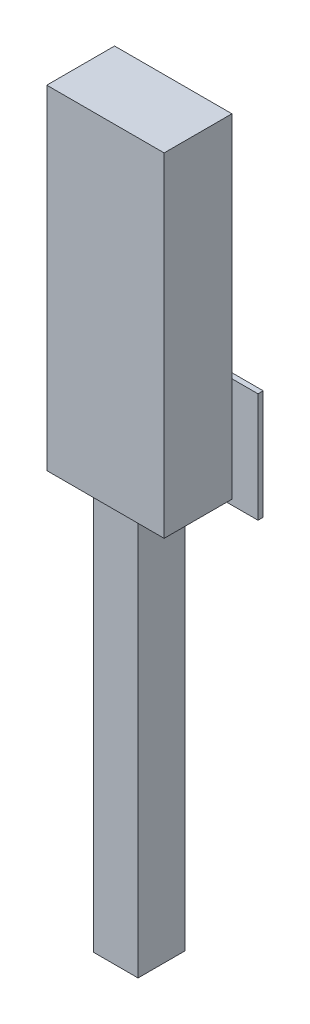
ISO-10303-21;
HEADER;
FILE_DESCRIPTION(('STEP AP214'),'2;1');
FILE_NAME('part.step','',(''),(''),'','','');
FILE_SCHEMA(('AUTOMOTIVE_DESIGN { 1 0 10303 214 1 1 1 1 }'));
ENDSEC;
DATA;
#1=APPLICATION_CONTEXT('core data for automotive mechanical design processes');
#2=APPLICATION_PROTOCOL_DEFINITION('international standard','automotive_design',2000,#1);
#3=PRODUCT_CONTEXT('',#1,'mechanical');
#4=PRODUCT('Part','Part','',(#3));
#5=PRODUCT_RELATED_PRODUCT_CATEGORY('part','',(#4));
#6=PRODUCT_DEFINITION_FORMATION('','',#4);
#7=PRODUCT_DEFINITION_CONTEXT('part definition',#1,'design');
#8=PRODUCT_DEFINITION('design','',#6,#7);
#9=PRODUCT_DEFINITION_SHAPE('','',#8);
#10=(LENGTH_UNIT() NAMED_UNIT(*) SI_UNIT(.MILLI.,.METRE.));
#11=(NAMED_UNIT(*) PLANE_ANGLE_UNIT() SI_UNIT($,.RADIAN.));
#12=(NAMED_UNIT(*) SI_UNIT($,.STERADIAN.) SOLID_ANGLE_UNIT());
#13=UNCERTAINTY_MEASURE_WITH_UNIT(LENGTH_MEASURE(1.E-05),#10,'distance_accuracy_value','');
#14=(GEOMETRIC_REPRESENTATION_CONTEXT(3) GLOBAL_UNCERTAINTY_ASSIGNED_CONTEXT((#13)) GLOBAL_UNIT_ASSIGNED_CONTEXT((#10,
#11,#12)) REPRESENTATION_CONTEXT('',''));
#15=CARTESIAN_POINT('',(0.,0.,0.));
#16=DIRECTION('',(0.,0.,1.));
#17=DIRECTION('',(1.,0.,0.));
#18=AXIS2_PLACEMENT_3D('',#15,#16,#17);
#19=CARTESIAN_POINT('',(96.,150.,48.));
#20=DIRECTION('',(0.,0.,-1.));
#21=DIRECTION('',(-1.,0.,0.));
#22=AXIS2_PLACEMENT_3D('',#19,#20,#21);
#23=PLANE('',#22);
#24=DIRECTION('',(0.,-1.,0.));
#25=VECTOR('',#24,1.);
#26=CARTESIAN_POINT('',(30.,150.,48.));
#27=LINE('',#26,#25);
#28=CARTESIAN_POINT('',(30.,192.,48.));
#29=VERTEX_POINT('',#28);
#30=CARTESIAN_POINT('',(30.,150.,48.));
#31=VERTEX_POINT('',#30);
#32=EDGE_CURVE('E115',#29,#31,#27,.T.);
#33=ORIENTED_EDGE('',*,*,#32,.T.);
#34=DIRECTION('',(-1.,0.,0.));
#35=VECTOR('',#34,1.);
#36=CARTESIAN_POINT('',(96.,150.,48.));
#37=LINE('',#36,#35);
#38=CARTESIAN_POINT('',(96.,150.,48.));
#39=VERTEX_POINT('',#38);
#40=EDGE_CURVE('E12',#39,#31,#37,.T.);
#41=ORIENTED_EDGE('',*,*,#40,.F.);
#42=DIRECTION('',(0.,-1.,0.));
#43=VECTOR('',#42,1.);
#44=CARTESIAN_POINT('',(96.,150.,48.));
#45=LINE('',#44,#43);
#46=CARTESIAN_POINT('',(96.,192.,48.));
#47=VERTEX_POINT('',#46);
#48=EDGE_CURVE('E103',#47,#39,#45,.T.);
#49=ORIENTED_EDGE('',*,*,#48,.F.);
#50=DIRECTION('',(-1.,0.,0.));
#51=VECTOR('',#50,1.);
#52=CARTESIAN_POINT('',(96.,192.,48.));
#53=LINE('',#52,#51);
#54=EDGE_CURVE('E111',#47,#29,#53,.T.);
#55=ORIENTED_EDGE('',*,*,#54,.T.);
#56=EDGE_LOOP('',(#33,#41,#49,#55));
#57=FACE_BOUND('',#56,.T.);
#58=ADVANCED_FACE('F52',(#57),#23,.F.);
#59=CARTESIAN_POINT('',(96.,150.,46.));
#60=DIRECTION('',(0.,1.,0.));
#61=DIRECTION('',(0.,0.,1.));
#62=AXIS2_PLACEMENT_3D('',#59,#60,#61);
#63=PLANE('',#62);
#64=DIRECTION('',(0.,0.,-1.));
#65=VECTOR('',#64,1.);
#66=CARTESIAN_POINT('',(30.,150.,46.));
#67=LINE('',#66,#65);
#68=CARTESIAN_POINT('',(30.,150.,46.));
#69=VERTEX_POINT('',#68);
#70=EDGE_CURVE('E107',#31,#69,#67,.T.);
#71=ORIENTED_EDGE('',*,*,#70,.T.);
#72=DIRECTION('',(-1.,0.,0.));
#73=VECTOR('',#72,1.);
#74=CARTESIAN_POINT('',(96.,150.,46.));
#75=LINE('',#74,#73);
#76=CARTESIAN_POINT('',(96.,150.,46.));
#77=VERTEX_POINT('',#76);
#78=EDGE_CURVE('E60',#77,#69,#75,.T.);
#79=ORIENTED_EDGE('',*,*,#78,.F.);
#80=DIRECTION('',(0.,0.,-1.));
#81=VECTOR('',#80,1.);
#82=CARTESIAN_POINT('',(96.,150.,46.));
#83=LINE('',#82,#81);
#84=EDGE_CURVE('E98',#39,#77,#83,.T.);
#85=ORIENTED_EDGE('',*,*,#84,.F.);
#86=ORIENTED_EDGE('',*,*,#40,.T.);
#87=EDGE_LOOP('',(#71,#79,#85,#86));
#88=FACE_BOUND('',#87,.T.);
#89=ADVANCED_FACE('F106',(#88),#63,.F.);
#90=CARTESIAN_POINT('',(96.,150.,46.));
#91=DIRECTION('',(0.,0.,1.));
#92=DIRECTION('',(1.,0.,0.));
#93=AXIS2_PLACEMENT_3D('',#90,#91,#92);
#94=PLANE('',#93);
#95=DIRECTION('',(0.,1.,0.));
#96=VECTOR('',#95,1.);
#97=CARTESIAN_POINT('',(30.,150.,46.));
#98=LINE('',#97,#96);
#99=CARTESIAN_POINT('',(30.,192.,46.));
#100=VERTEX_POINT('',#99);
#101=EDGE_CURVE('E85',#69,#100,#98,.T.);
#102=ORIENTED_EDGE('',*,*,#101,.T.);
#103=DIRECTION('',(-1.,0.,0.));
#104=VECTOR('',#103,1.);
#105=CARTESIAN_POINT('',(96.,192.,46.));
#106=LINE('',#105,#104);
#107=CARTESIAN_POINT('',(96.,192.,46.));
#108=VERTEX_POINT('',#107);
#109=EDGE_CURVE('E108',#108,#100,#106,.T.);
#110=ORIENTED_EDGE('',*,*,#109,.F.);
#111=DIRECTION('',(0.,1.,0.));
#112=VECTOR('',#111,1.);
#113=CARTESIAN_POINT('',(96.,150.,46.));
#114=LINE('',#113,#112);
#115=EDGE_CURVE('E101',#77,#108,#114,.T.);
#116=ORIENTED_EDGE('',*,*,#115,.F.);
#117=ORIENTED_EDGE('',*,*,#78,.T.);
#118=EDGE_LOOP('',(#102,#110,#116,#117));
#119=FACE_BOUND('',#118,.T.);
#120=ADVANCED_FACE('F109',(#119),#94,.F.);
#121=CARTESIAN_POINT('',(96.,192.,46.));
#122=DIRECTION('',(0.,-1.,0.));
#123=DIRECTION('',(0.,0.,-1.));
#124=AXIS2_PLACEMENT_3D('',#121,#122,#123);
#125=PLANE('',#124);
#126=DIRECTION('',(0.,0.,1.));
#127=VECTOR('',#126,1.);
#128=CARTESIAN_POINT('',(30.,192.,46.));
#129=LINE('',#128,#127);
#130=EDGE_CURVE('E91',#100,#29,#129,.T.);
#131=ORIENTED_EDGE('',*,*,#130,.T.);
#132=ORIENTED_EDGE('',*,*,#54,.F.);
#133=DIRECTION('',(0.,0.,1.));
#134=VECTOR('',#133,1.);
#135=CARTESIAN_POINT('',(96.,192.,46.));
#136=LINE('',#135,#134);
#137=EDGE_CURVE('E68',#108,#47,#136,.T.);
#138=ORIENTED_EDGE('',*,*,#137,.F.);
#139=ORIENTED_EDGE('',*,*,#109,.T.);
#140=EDGE_LOOP('',(#131,#132,#138,#139));
#141=FACE_BOUND('',#140,.T.);
#142=ADVANCED_FACE('F122',(#141),#125,.F.);
#143=CARTESIAN_POINT('',(96.,0.,0.));
#144=DIRECTION('',(1.,0.,0.));
#145=DIRECTION('',(0.,0.,-1.));
#146=AXIS2_PLACEMENT_3D('',#143,#144,#145);
#147=PLANE('',#146);
#148=ORIENTED_EDGE('',*,*,#48,.T.);
#149=ORIENTED_EDGE('',*,*,#84,.T.);
#150=ORIENTED_EDGE('',*,*,#115,.T.);
#151=ORIENTED_EDGE('',*,*,#137,.T.);
#152=EDGE_LOOP('',(#148,#149,#150,#151));
#153=FACE_BOUND('',#152,.T.);
#154=ADVANCED_FACE('F99',(#153),#147,.T.);
#155=CARTESIAN_POINT('',(30.,0.,0.));
#156=DIRECTION('',(1.,0.,0.));
#157=DIRECTION('',(0.,0.,-1.));
#158=AXIS2_PLACEMENT_3D('',#155,#156,#157);
#159=PLANE('',#158);
#160=ORIENTED_EDGE('',*,*,#32,.F.);
#161=ORIENTED_EDGE('',*,*,#130,.F.);
#162=ORIENTED_EDGE('',*,*,#101,.F.);
#163=ORIENTED_EDGE('',*,*,#70,.F.);
#164=EDGE_LOOP('',(#160,#161,#162,#163));
#165=FACE_BOUND('',#164,.T.);
#166=ADVANCED_FACE('F125',(#165),#159,.F.);
#167=CLOSED_SHELL('',(#58,#89,#120,#142,#154,#166));
#168=MANIFOLD_SOLID_BREP('B2',#167);
#169=CARTESIAN_POINT('',(75.,0.,73.));
#170=DIRECTION('',(0.,0.,-1.));
#171=DIRECTION('',(-1.,0.,0.));
#172=AXIS2_PLACEMENT_3D('',#169,#170,#171);
#173=PLANE('',#172);
#174=DIRECTION('',(0.,-1.,0.));
#175=VECTOR('',#174,1.);
#176=CARTESIAN_POINT('',(58.,0.,73.));
#177=LINE('',#176,#175);
#178=CARTESIAN_POINT('',(58.,155.,73.));
#179=VERTEX_POINT('',#178);
#180=CARTESIAN_POINT('',(58.,0.,73.));
#181=VERTEX_POINT('',#180);
#182=EDGE_CURVE('E247',#179,#181,#177,.T.);
#183=ORIENTED_EDGE('',*,*,#182,.T.);
#184=DIRECTION('',(-1.,0.,0.));
#185=VECTOR('',#184,1.);
#186=CARTESIAN_POINT('',(75.,0.,73.));
#187=LINE('',#186,#185);
#188=CARTESIAN_POINT('',(75.,0.,73.));
#189=VERTEX_POINT('',#188);
#190=EDGE_CURVE('E50',#189,#181,#187,.T.);
#191=ORIENTED_EDGE('',*,*,#190,.F.);
#192=DIRECTION('',(0.,-1.,0.));
#193=VECTOR('',#192,1.);
#194=CARTESIAN_POINT('',(75.,0.,73.));
#195=LINE('',#194,#193);
#196=CARTESIAN_POINT('',(75.,155.,73.));
#197=VERTEX_POINT('',#196);
#198=EDGE_CURVE('E235',#197,#189,#195,.T.);
#199=ORIENTED_EDGE('',*,*,#198,.F.);
#200=DIRECTION('',(-1.,0.,0.));
#201=VECTOR('',#200,1.);
#202=CARTESIAN_POINT('',(75.,155.,73.));
#203=LINE('',#202,#201);
#204=EDGE_CURVE('E243',#197,#179,#203,.T.);
#205=ORIENTED_EDGE('',*,*,#204,.T.);
#206=EDGE_LOOP('',(#183,#191,#199,#205));
#207=FACE_BOUND('',#206,.T.);
#208=ADVANCED_FACE('F184',(#207),#173,.F.);
#209=CARTESIAN_POINT('',(75.,0.,55.));
#210=DIRECTION('',(0.,1.,0.));
#211=DIRECTION('',(0.,0.,1.));
#212=AXIS2_PLACEMENT_3D('',#209,#210,#211);
#213=PLANE('',#212);
#214=DIRECTION('',(0.,0.,-1.));
#215=VECTOR('',#214,1.);
#216=CARTESIAN_POINT('',(58.,0.,55.));
#217=LINE('',#216,#215);
#218=CARTESIAN_POINT('',(58.,0.,55.));
#219=VERTEX_POINT('',#218);
#220=EDGE_CURVE('E239',#181,#219,#217,.T.);
#221=ORIENTED_EDGE('',*,*,#220,.T.);
#222=DIRECTION('',(-1.,0.,0.));
#223=VECTOR('',#222,1.);
#224=CARTESIAN_POINT('',(75.,0.,55.));
#225=LINE('',#224,#223);
#226=CARTESIAN_POINT('',(75.,0.,55.));
#227=VERTEX_POINT('',#226);
#228=EDGE_CURVE('E192',#227,#219,#225,.T.);
#229=ORIENTED_EDGE('',*,*,#228,.F.);
#230=DIRECTION('',(0.,0.,-1.));
#231=VECTOR('',#230,1.);
#232=CARTESIAN_POINT('',(75.,0.,55.));
#233=LINE('',#232,#231);
#234=EDGE_CURVE('E230',#189,#227,#233,.T.);
#235=ORIENTED_EDGE('',*,*,#234,.F.);
#236=ORIENTED_EDGE('',*,*,#190,.T.);
#237=EDGE_LOOP('',(#221,#229,#235,#236));
#238=FACE_BOUND('',#237,.T.);
#239=ADVANCED_FACE('F238',(#238),#213,.F.);
#240=CARTESIAN_POINT('',(75.,0.,55.));
#241=DIRECTION('',(0.,0.,1.));
#242=DIRECTION('',(1.,0.,0.));
#243=AXIS2_PLACEMENT_3D('',#240,#241,#242);
#244=PLANE('',#243);
#245=DIRECTION('',(0.,1.,0.));
#246=VECTOR('',#245,1.);
#247=CARTESIAN_POINT('',(58.,0.,55.));
#248=LINE('',#247,#246);
#249=CARTESIAN_POINT('',(58.,155.,55.));
#250=VERTEX_POINT('',#249);
#251=EDGE_CURVE('E217',#219,#250,#248,.T.);
#252=ORIENTED_EDGE('',*,*,#251,.T.);
#253=DIRECTION('',(-1.,0.,0.));
#254=VECTOR('',#253,1.);
#255=CARTESIAN_POINT('',(75.,155.,55.));
#256=LINE('',#255,#254);
#257=CARTESIAN_POINT('',(75.,155.,55.));
#258=VERTEX_POINT('',#257);
#259=EDGE_CURVE('E240',#258,#250,#256,.T.);
#260=ORIENTED_EDGE('',*,*,#259,.F.);
#261=DIRECTION('',(0.,1.,0.));
#262=VECTOR('',#261,1.);
#263=CARTESIAN_POINT('',(75.,0.,55.));
#264=LINE('',#263,#262);
#265=EDGE_CURVE('E233',#227,#258,#264,.T.);
#266=ORIENTED_EDGE('',*,*,#265,.F.);
#267=ORIENTED_EDGE('',*,*,#228,.T.);
#268=EDGE_LOOP('',(#252,#260,#266,#267));
#269=FACE_BOUND('',#268,.T.);
#270=ADVANCED_FACE('F241',(#269),#244,.F.);
#271=CARTESIAN_POINT('',(75.,155.,55.));
#272=DIRECTION('',(0.,-1.,0.));
#273=DIRECTION('',(0.,0.,-1.));
#274=AXIS2_PLACEMENT_3D('',#271,#272,#273);
#275=PLANE('',#274);
#276=DIRECTION('',(0.,0.,1.));
#277=VECTOR('',#276,1.);
#278=CARTESIAN_POINT('',(58.,155.,55.));
#279=LINE('',#278,#277);
#280=EDGE_CURVE('E223',#250,#179,#279,.T.);
#281=ORIENTED_EDGE('',*,*,#280,.T.);
#282=ORIENTED_EDGE('',*,*,#204,.F.);
#283=DIRECTION('',(0.,0.,1.));
#284=VECTOR('',#283,1.);
#285=CARTESIAN_POINT('',(75.,155.,55.));
#286=LINE('',#285,#284);
#287=EDGE_CURVE('E200',#258,#197,#286,.T.);
#288=ORIENTED_EDGE('',*,*,#287,.F.);
#289=ORIENTED_EDGE('',*,*,#259,.T.);
#290=EDGE_LOOP('',(#281,#282,#288,#289));
#291=FACE_BOUND('',#290,.T.);
#292=ADVANCED_FACE('F254',(#291),#275,.F.);
#293=CARTESIAN_POINT('',(75.,0.,0.));
#294=DIRECTION('',(1.,0.,0.));
#295=DIRECTION('',(0.,0.,-1.));
#296=AXIS2_PLACEMENT_3D('',#293,#294,#295);
#297=PLANE('',#296);
#298=ORIENTED_EDGE('',*,*,#198,.T.);
#299=ORIENTED_EDGE('',*,*,#234,.T.);
#300=ORIENTED_EDGE('',*,*,#265,.T.);
#301=ORIENTED_EDGE('',*,*,#287,.T.);
#302=EDGE_LOOP('',(#298,#299,#300,#301));
#303=FACE_BOUND('',#302,.T.);
#304=ADVANCED_FACE('F231',(#303),#297,.T.);
#305=CARTESIAN_POINT('',(58.,0.,0.));
#306=DIRECTION('',(1.,0.,0.));
#307=DIRECTION('',(0.,0.,-1.));
#308=AXIS2_PLACEMENT_3D('',#305,#306,#307);
#309=PLANE('',#308);
#310=ORIENTED_EDGE('',*,*,#182,.F.);
#311=ORIENTED_EDGE('',*,*,#280,.F.);
#312=ORIENTED_EDGE('',*,*,#251,.F.);
#313=ORIENTED_EDGE('',*,*,#220,.F.);
#314=EDGE_LOOP('',(#310,#311,#312,#313));
#315=FACE_BOUND('',#314,.T.);
#316=ADVANCED_FACE('F257',(#315),#309,.F.);
#317=CLOSED_SHELL('',(#208,#239,#270,#292,#304,#316));
#318=MANIFOLD_SOLID_BREP('B6',#317);
#319=CARTESIAN_POINT('',(66.34,278.,59.5));
#320=DIRECTION('',(0.,-1.,0.));
#321=DIRECTION('',(0.,0.,-1.));
#322=AXIS2_PLACEMENT_3D('',#319,#320,#321);
#323=CYLINDRICAL_SURFACE('',#322,5.);
#324=CARTESIAN_POINT('',(66.34,278.,59.5));
#325=DIRECTION('',(0.,1.,0.));
#326=DIRECTION('',(0.,0.,1.));
#327=AXIS2_PLACEMENT_3D('',#324,#325,#326);
#328=CIRCLE('',#327,5.);
#329=CARTESIAN_POINT('',(66.34,278.,64.5));
#330=VERTEX_POINT('',#329);
#331=EDGE_CURVE('E183',#330,#330,#328,.T.);
#332=ORIENTED_EDGE('',*,*,#331,.F.);
#333=EDGE_LOOP('',(#332));
#334=FACE_BOUND('',#333,.T.);
#335=CARTESIAN_POINT('',(66.34,160.,59.5));
#336=DIRECTION('',(0.,1.,0.));
#337=DIRECTION('',(0.,0.,1.));
#338=AXIS2_PLACEMENT_3D('',#335,#336,#337);
#339=CIRCLE('',#338,5.);
#340=CARTESIAN_POINT('',(66.34,160.,64.5));
#341=VERTEX_POINT('',#340);
#342=EDGE_CURVE('E320',#341,#341,#339,.T.);
#343=ORIENTED_EDGE('',*,*,#342,.T.);
#344=EDGE_LOOP('',(#343));
#345=FACE_BOUND('',#344,.T.);
#346=ADVANCED_FACE('F317',(#334,#345),#323,.T.);
#347=CARTESIAN_POINT('',(66.34,278.,59.5));
#348=DIRECTION('',(0.,1.,0.));
#349=DIRECTION('',(0.,0.,1.));
#350=AXIS2_PLACEMENT_3D('',#347,#348,#349);
#351=PLANE('',#350);
#352=ORIENTED_EDGE('',*,*,#331,.T.);
#353=EDGE_LOOP('',(#352));
#354=FACE_BOUND('',#353,.T.);
#355=ADVANCED_FACE('F332',(#354),#351,.T.);
#356=CARTESIAN_POINT('',(66.34,160.,59.5));
#357=DIRECTION('',(0.,1.,0.));
#358=DIRECTION('',(0.,0.,1.));
#359=AXIS2_PLACEMENT_3D('',#356,#357,#358);
#360=PLANE('',#359);
#361=ORIENTED_EDGE('',*,*,#342,.F.);
#362=EDGE_LOOP('',(#361));
#363=FACE_BOUND('',#362,.T.);
#364=ADVANCED_FACE('F330',(#363),#360,.F.);
#365=CLOSED_SHELL('',(#346,#355,#364));
#366=MANIFOLD_SOLID_BREP('B44',#365);
#367=CARTESIAN_POINT('',(89.,155.,77.));
#368=DIRECTION('',(0.,0.,-1.));
#369=DIRECTION('',(-1.,0.,0.));
#370=AXIS2_PLACEMENT_3D('',#367,#368,#369);
#371=PLANE('',#370);
#372=DIRECTION('',(0.,-1.,0.));
#373=VECTOR('',#372,1.);
#374=CARTESIAN_POINT('',(44.,155.,77.));
#375=LINE('',#374,#373);
#376=CARTESIAN_POINT('',(44.,283.,77.));
#377=VERTEX_POINT('',#376);
#378=CARTESIAN_POINT('',(44.,155.,77.));
#379=VERTEX_POINT('',#378);
#380=EDGE_CURVE('E453',#377,#379,#375,.T.);
#381=ORIENTED_EDGE('',*,*,#380,.T.);
#382=DIRECTION('',(-1.,0.,0.));
#383=VECTOR('',#382,1.);
#384=CARTESIAN_POINT('',(89.,155.,77.));
#385=LINE('',#384,#383);
#386=CARTESIAN_POINT('',(89.,155.,77.));
#387=VERTEX_POINT('',#386);
#388=EDGE_CURVE('E478',#387,#379,#385,.T.);
#389=ORIENTED_EDGE('',*,*,#388,.F.);
#390=DIRECTION('',(0.,-1.,0.));
#391=VECTOR('',#390,1.);
#392=CARTESIAN_POINT('',(89.,155.,77.));
#393=LINE('',#392,#391);
#394=CARTESIAN_POINT('',(89.,283.,77.));
#395=VERTEX_POINT('',#394);
#396=EDGE_CURVE('E461',#395,#387,#393,.T.);
#397=ORIENTED_EDGE('',*,*,#396,.F.);
#398=DIRECTION('',(-1.,0.,0.));
#399=VECTOR('',#398,1.);
#400=CARTESIAN_POINT('',(89.,283.,77.));
#401=LINE('',#400,#399);
#402=EDGE_CURVE('E466',#395,#377,#401,.T.);
#403=ORIENTED_EDGE('',*,*,#402,.T.);
#404=EDGE_LOOP('',(#381,#389,#397,#403));
#405=FACE_BOUND('',#404,.T.);
#406=ADVANCED_FACE('F358',(#405),#371,.F.);
#407=CARTESIAN_POINT('',(89.,155.,51.));
#408=DIRECTION('',(0.,1.,0.));
#409=DIRECTION('',(0.,0.,1.));
#410=AXIS2_PLACEMENT_3D('',#407,#408,#409);
#411=PLANE('',#410);
#412=DIRECTION('',(0.,0.,-1.));
#413=VECTOR('',#412,1.);
#414=CARTESIAN_POINT('',(44.,155.,51.));
#415=LINE('',#414,#413);
#416=CARTESIAN_POINT('',(44.,155.,51.));
#417=VERTEX_POINT('',#416);
#418=EDGE_CURVE('E456',#379,#417,#415,.T.);
#419=ORIENTED_EDGE('',*,*,#418,.T.);
#420=DIRECTION('',(-1.,0.,0.));
#421=VECTOR('',#420,1.);
#422=CARTESIAN_POINT('',(89.,155.,51.));
#423=LINE('',#422,#421);
#424=CARTESIAN_POINT('',(89.,155.,51.));
#425=VERTEX_POINT('',#424);
#426=EDGE_CURVE('E475',#425,#417,#423,.T.);
#427=ORIENTED_EDGE('',*,*,#426,.F.);
#428=DIRECTION('',(0.,0.,-1.));
#429=VECTOR('',#428,1.);
#430=CARTESIAN_POINT('',(89.,155.,51.));
#431=LINE('',#430,#429);
#432=EDGE_CURVE('E410',#387,#425,#431,.T.);
#433=ORIENTED_EDGE('',*,*,#432,.F.);
#434=ORIENTED_EDGE('',*,*,#388,.T.);
#435=EDGE_LOOP('',(#419,#427,#433,#434));
#436=FACE_BOUND('',#435,.T.);
#437=ADVANCED_FACE('F506',(#436),#411,.F.);
#438=CARTESIAN_POINT('',(89.,155.,51.));
#439=DIRECTION('',(0.,0.,1.));
#440=DIRECTION('',(1.,0.,0.));
#441=AXIS2_PLACEMENT_3D('',#438,#439,#440);
#442=PLANE('',#441);
#443=DIRECTION('',(-1.,0.,0.));
#444=VECTOR('',#443,1.);
#445=CARTESIAN_POINT('',(89.,158.,51.));
#446=LINE('',#445,#444);
#447=CARTESIAN_POINT('',(86.,158.,51.));
#448=VERTEX_POINT('',#447);
#449=CARTESIAN_POINT('',(47.,158.,51.));
#450=VERTEX_POINT('',#449);
#451=EDGE_CURVE('E365',#448,#450,#446,.T.);
#452=ORIENTED_EDGE('',*,*,#451,.F.);
#453=DIRECTION('',(0.,1.,0.));
#454=VECTOR('',#453,1.);
#455=CARTESIAN_POINT('',(86.,155.,51.));
#456=LINE('',#455,#454);
#457=CARTESIAN_POINT('',(86.,280.,51.));
#458=VERTEX_POINT('',#457);
#459=EDGE_CURVE('E315',#448,#458,#456,.T.);
#460=ORIENTED_EDGE('',*,*,#459,.T.);
#461=DIRECTION('',(1.,0.,0.));
#462=VECTOR('',#461,1.);
#463=CARTESIAN_POINT('',(89.,280.,51.));
#464=LINE('',#463,#462);
#465=CARTESIAN_POINT('',(47.,280.,51.));
#466=VERTEX_POINT('',#465);
#467=EDGE_CURVE('E482',#466,#458,#464,.T.);
#468=ORIENTED_EDGE('',*,*,#467,.F.);
#469=DIRECTION('',(0.,1.,0.));
#470=VECTOR('',#469,1.);
#471=CARTESIAN_POINT('',(47.,155.,51.));
#472=LINE('',#471,#470);
#473=EDGE_CURVE('E480',#450,#466,#472,.T.);
#474=ORIENTED_EDGE('',*,*,#473,.F.);
#475=EDGE_LOOP('',(#452,#460,#468,#474));
#476=FACE_BOUND('',#475,.T.);
#477=DIRECTION('',(0.,1.,0.));
#478=VECTOR('',#477,1.);
#479=CARTESIAN_POINT('',(44.,155.,51.));
#480=LINE('',#479,#478);
#481=CARTESIAN_POINT('',(44.,283.,51.));
#482=VERTEX_POINT('',#481);
#483=EDGE_CURVE('E469',#417,#482,#480,.T.);
#484=ORIENTED_EDGE('',*,*,#483,.T.);
#485=DIRECTION('',(-1.,0.,0.));
#486=VECTOR('',#485,1.);
#487=CARTESIAN_POINT('',(89.,283.,51.));
#488=LINE('',#487,#486);
#489=CARTESIAN_POINT('',(89.,283.,51.));
#490=VERTEX_POINT('',#489);
#491=EDGE_CURVE('E473',#490,#482,#488,.T.);
#492=ORIENTED_EDGE('',*,*,#491,.F.);
#493=DIRECTION('',(0.,1.,0.));
#494=VECTOR('',#493,1.);
#495=CARTESIAN_POINT('',(89.,155.,51.));
#496=LINE('',#495,#494);
#497=EDGE_CURVE('E464',#425,#490,#496,.T.);
#498=ORIENTED_EDGE('',*,*,#497,.F.);
#499=ORIENTED_EDGE('',*,*,#426,.T.);
#500=EDGE_LOOP('',(#484,#492,#498,#499));
#501=FACE_BOUND('',#500,.T.);
#502=ADVANCED_FACE('F486',(#476,#501),#442,.F.);
#503=CARTESIAN_POINT('',(89.,283.,51.));
#504=DIRECTION('',(0.,-1.,0.));
#505=DIRECTION('',(0.,0.,-1.));
#506=AXIS2_PLACEMENT_3D('',#503,#504,#505);
#507=PLANE('',#506);
#508=DIRECTION('',(0.,0.,1.));
#509=VECTOR('',#508,1.);
#510=CARTESIAN_POINT('',(44.,283.,51.));
#511=LINE('',#510,#509);
#512=EDGE_CURVE('E402',#482,#377,#511,.T.);
#513=ORIENTED_EDGE('',*,*,#512,.T.);
#514=ORIENTED_EDGE('',*,*,#402,.F.);
#515=DIRECTION('',(0.,0.,1.));
#516=VECTOR('',#515,1.);
#517=CARTESIAN_POINT('',(89.,283.,51.));
#518=LINE('',#517,#516);
#519=EDGE_CURVE('E381',#490,#395,#518,.T.);
#520=ORIENTED_EDGE('',*,*,#519,.F.);
#521=ORIENTED_EDGE('',*,*,#491,.T.);
#522=EDGE_LOOP('',(#513,#514,#520,#521));
#523=FACE_BOUND('',#522,.T.);
#524=ADVANCED_FACE('F520',(#523),#507,.F.);
#525=CARTESIAN_POINT('',(89.,0.,0.));
#526=DIRECTION('',(1.,0.,0.));
#527=DIRECTION('',(0.,0.,-1.));
#528=AXIS2_PLACEMENT_3D('',#525,#526,#527);
#529=PLANE('',#528);
#530=ORIENTED_EDGE('',*,*,#396,.T.);
#531=ORIENTED_EDGE('',*,*,#432,.T.);
#532=ORIENTED_EDGE('',*,*,#497,.T.);
#533=ORIENTED_EDGE('',*,*,#519,.T.);
#534=EDGE_LOOP('',(#530,#531,#532,#533));
#535=FACE_BOUND('',#534,.T.);
#536=ADVANCED_FACE('F518',(#535),#529,.T.);
#537=CARTESIAN_POINT('',(44.,0.,0.));
#538=DIRECTION('',(1.,0.,0.));
#539=DIRECTION('',(0.,0.,-1.));
#540=AXIS2_PLACEMENT_3D('',#537,#538,#539);
#541=PLANE('',#540);
#542=ORIENTED_EDGE('',*,*,#380,.F.);
#543=ORIENTED_EDGE('',*,*,#512,.F.);
#544=ORIENTED_EDGE('',*,*,#483,.F.);
#545=ORIENTED_EDGE('',*,*,#418,.F.);
#546=EDGE_LOOP('',(#542,#543,#544,#545));
#547=FACE_BOUND('',#546,.T.);
#548=ADVANCED_FACE('F502',(#547),#541,.F.);
#549=CARTESIAN_POINT('',(86.,158.,45.));
#550=DIRECTION('',(0.,1.,0.));
#551=DIRECTION('',(0.,0.,1.));
#552=AXIS2_PLACEMENT_3D('',#549,#550,#551);
#553=PLANE('',#552);
#554=ORIENTED_EDGE('',*,*,#451,.T.);
#555=DIRECTION('',(0.,0.,-1.));
#556=VECTOR('',#555,1.);
#557=CARTESIAN_POINT('',(47.,158.,45.));
#558=LINE('',#557,#556);
#559=CARTESIAN_POINT('',(47.,158.,74.));
#560=VERTEX_POINT('',#559);
#561=EDGE_CURVE('E372',#560,#450,#558,.T.);
#562=ORIENTED_EDGE('',*,*,#561,.F.);
#563=DIRECTION('',(-1.,0.,0.));
#564=VECTOR('',#563,1.);
#565=CARTESIAN_POINT('',(86.,158.,74.));
#566=LINE('',#565,#564);
#567=CARTESIAN_POINT('',(86.,158.,74.));
#568=VERTEX_POINT('',#567);
#569=EDGE_CURVE('E447',#568,#560,#566,.T.);
#570=ORIENTED_EDGE('',*,*,#569,.F.);
#571=DIRECTION('',(0.,0.,-1.));
#572=VECTOR('',#571,1.);
#573=CARTESIAN_POINT('',(86.,158.,45.));
#574=LINE('',#573,#572);
#575=EDGE_CURVE('E432',#568,#448,#574,.T.);
#576=ORIENTED_EDGE('',*,*,#575,.T.);
#577=EDGE_LOOP('',(#554,#562,#570,#576));
#578=FACE_BOUND('',#577,.T.);
#579=ADVANCED_FACE('F452',(#578),#553,.T.);
#580=CARTESIAN_POINT('',(86.,280.,45.));
#581=DIRECTION('',(0.,-1.,0.));
#582=DIRECTION('',(0.,0.,-1.));
#583=AXIS2_PLACEMENT_3D('',#580,#581,#582);
#584=PLANE('',#583);
#585=ORIENTED_EDGE('',*,*,#467,.T.);
#586=DIRECTION('',(0.,0.,1.));
#587=VECTOR('',#586,1.);
#588=CARTESIAN_POINT('',(86.,280.,45.));
#589=LINE('',#588,#587);
#590=CARTESIAN_POINT('',(86.,280.,74.));
#591=VERTEX_POINT('',#590);
#592=EDGE_CURVE('E440',#458,#591,#589,.T.);
#593=ORIENTED_EDGE('',*,*,#592,.T.);
#594=DIRECTION('',(-1.,0.,0.));
#595=VECTOR('',#594,1.);
#596=CARTESIAN_POINT('',(86.,280.,74.));
#597=LINE('',#596,#595);
#598=CARTESIAN_POINT('',(47.,280.,74.));
#599=VERTEX_POINT('',#598);
#600=EDGE_CURVE('E449',#591,#599,#597,.T.);
#601=ORIENTED_EDGE('',*,*,#600,.T.);
#602=DIRECTION('',(0.,0.,1.));
#603=VECTOR('',#602,1.);
#604=CARTESIAN_POINT('',(47.,280.,45.));
#605=LINE('',#604,#603);
#606=EDGE_CURVE('E450',#466,#599,#605,.T.);
#607=ORIENTED_EDGE('',*,*,#606,.F.);
#608=EDGE_LOOP('',(#585,#593,#601,#607));
#609=FACE_BOUND('',#608,.T.);
#610=ADVANCED_FACE('F491',(#609),#584,.T.);
#611=CARTESIAN_POINT('',(86.,0.,0.));
#612=DIRECTION('',(1.,0.,0.));
#613=DIRECTION('',(0.,0.,-1.));
#614=AXIS2_PLACEMENT_3D('',#611,#612,#613);
#615=PLANE('',#614);
#616=ORIENTED_EDGE('',*,*,#575,.F.);
#617=DIRECTION('',(0.,-1.,0.));
#618=VECTOR('',#617,1.);
#619=CARTESIAN_POINT('',(86.,158.,74.));
#620=LINE('',#619,#618);
#621=EDGE_CURVE('E436',#591,#568,#620,.T.);
#622=ORIENTED_EDGE('',*,*,#621,.F.);
#623=ORIENTED_EDGE('',*,*,#592,.F.);
#624=ORIENTED_EDGE('',*,*,#459,.F.);
#625=EDGE_LOOP('',(#616,#622,#623,#624));
#626=FACE_BOUND('',#625,.T.);
#627=ADVANCED_FACE('F434',(#626),#615,.F.);
#628=CARTESIAN_POINT('',(47.,0.,0.));
#629=DIRECTION('',(1.,0.,0.));
#630=DIRECTION('',(0.,0.,-1.));
#631=AXIS2_PLACEMENT_3D('',#628,#629,#630);
#632=PLANE('',#631);
#633=ORIENTED_EDGE('',*,*,#473,.T.);
#634=ORIENTED_EDGE('',*,*,#606,.T.);
#635=DIRECTION('',(0.,-1.,0.));
#636=VECTOR('',#635,1.);
#637=CARTESIAN_POINT('',(47.,158.,74.));
#638=LINE('',#637,#636);
#639=EDGE_CURVE('E492',#599,#560,#638,.T.);
#640=ORIENTED_EDGE('',*,*,#639,.T.);
#641=ORIENTED_EDGE('',*,*,#561,.T.);
#642=EDGE_LOOP('',(#633,#634,#640,#641));
#643=FACE_BOUND('',#642,.T.);
#644=ADVANCED_FACE('F489',(#643),#632,.T.);
#645=CARTESIAN_POINT('',(86.,158.,74.));
#646=DIRECTION('',(0.,0.,-1.));
#647=DIRECTION('',(-1.,0.,0.));
#648=AXIS2_PLACEMENT_3D('',#645,#646,#647);
#649=PLANE('',#648);
#650=ORIENTED_EDGE('',*,*,#639,.F.);
#651=ORIENTED_EDGE('',*,*,#600,.F.);
#652=ORIENTED_EDGE('',*,*,#621,.T.);
#653=ORIENTED_EDGE('',*,*,#569,.T.);
#654=EDGE_LOOP('',(#650,#651,#652,#653));
#655=FACE_BOUND('',#654,.T.);
#656=ADVANCED_FACE('F446',(#655),#649,.T.);
#657=CLOSED_SHELL('',(#406,#437,#502,#524,#536,#548,#579,#610,#627,#644,#656));
#658=MANIFOLD_SOLID_BREP('B178',#657);
#659=ADVANCED_BREP_SHAPE_REPRESENTATION('',(#18,#168,#318,#366,#658),#14);
#660=SHAPE_DEFINITION_REPRESENTATION(#9,#659);
ENDSEC;
END-ISO-10303-21;
